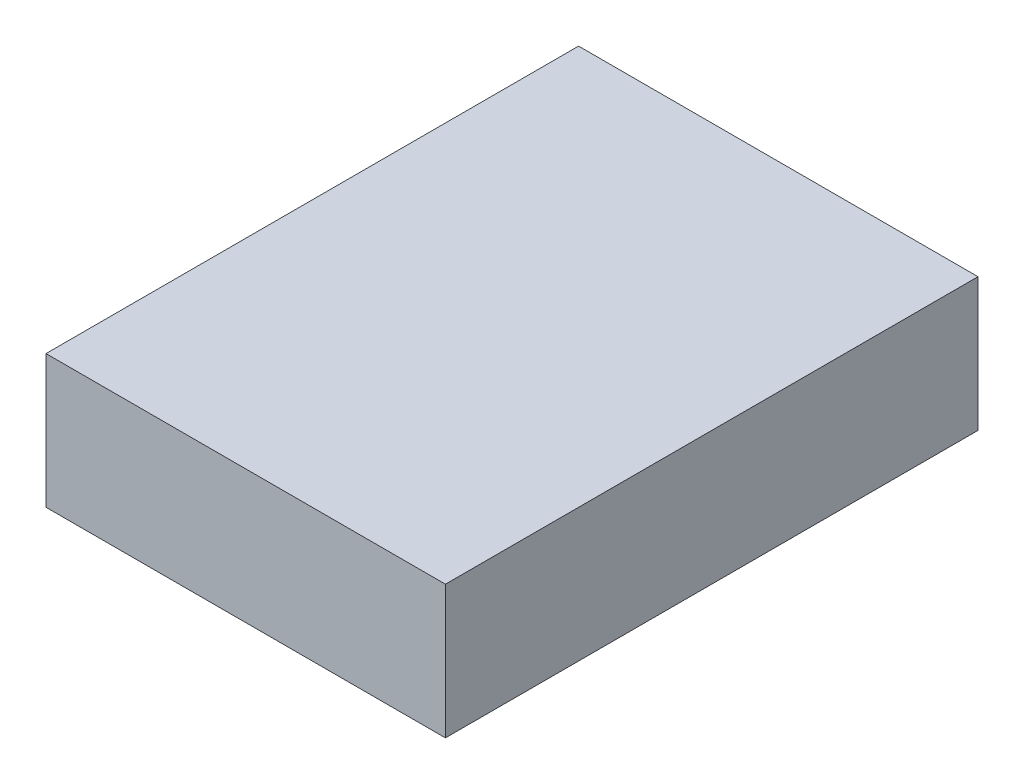
ISO-10303-21;
HEADER;
FILE_DESCRIPTION(('STEP AP214'),'2;1');
FILE_NAME('part.step','',(''),(''),'','','');
FILE_SCHEMA(('AUTOMOTIVE_DESIGN { 1 0 10303 214 1 1 1 1 }'));
ENDSEC;
DATA;
#1=APPLICATION_CONTEXT('core data for automotive mechanical design processes');
#2=APPLICATION_PROTOCOL_DEFINITION('international standard','automotive_design',2000,#1);
#3=PRODUCT_CONTEXT('',#1,'mechanical');
#4=PRODUCT('Part','Part','',(#3));
#5=PRODUCT_RELATED_PRODUCT_CATEGORY('part','',(#4));
#6=PRODUCT_DEFINITION_FORMATION('','',#4);
#7=PRODUCT_DEFINITION_CONTEXT('part definition',#1,'design');
#8=PRODUCT_DEFINITION('design','',#6,#7);
#9=PRODUCT_DEFINITION_SHAPE('','',#8);
#10=(LENGTH_UNIT() NAMED_UNIT(*) SI_UNIT(.MILLI.,.METRE.));
#11=(NAMED_UNIT(*) PLANE_ANGLE_UNIT() SI_UNIT($,.RADIAN.));
#12=(NAMED_UNIT(*) SI_UNIT($,.STERADIAN.) SOLID_ANGLE_UNIT());
#13=UNCERTAINTY_MEASURE_WITH_UNIT(LENGTH_MEASURE(1.E-05),#10,'distance_accuracy_value','');
#14=(GEOMETRIC_REPRESENTATION_CONTEXT(3) GLOBAL_UNCERTAINTY_ASSIGNED_CONTEXT((#13)) GLOBAL_UNIT_ASSIGNED_CONTEXT((#10,
#11,#12)) REPRESENTATION_CONTEXT('',''));
#15=CARTESIAN_POINT('',(0.,0.,0.));
#16=DIRECTION('',(0.,0.,1.));
#17=DIRECTION('',(1.,0.,0.));
#18=AXIS2_PLACEMENT_3D('',#15,#16,#17);
#19=CARTESIAN_POINT('',(-97.2314821254319,3.,-89.2737739004754));
#20=DIRECTION('',(-1.,0.,0.));
#21=DIRECTION('',(0.,0.,1.));
#22=AXIS2_PLACEMENT_3D('',#19,#20,#21);
#23=PLANE('',#22);
#24=DIRECTION('',(0.,0.,-1.));
#25=VECTOR('',#24,1.);
#26=CARTESIAN_POINT('',(-97.2314821254319,0.,-89.2737739004754));
#27=LINE('',#26,#25);
#28=CARTESIAN_POINT('',(-97.2314821254319,0.,-77.2737739004754));
#29=VERTEX_POINT('',#28);
#30=CARTESIAN_POINT('',(-97.2314821254319,0.,-89.2737739004754));
#31=VERTEX_POINT('',#30);
#32=EDGE_CURVE('E97',#29,#31,#27,.T.);
#33=ORIENTED_EDGE('',*,*,#32,.T.);
#34=DIRECTION('',(0.,-1.,0.));
#35=VECTOR('',#34,1.);
#36=CARTESIAN_POINT('',(-97.2314821254319,3.,-89.2737739004754));
#37=LINE('',#36,#35);
#38=CARTESIAN_POINT('',(-97.2314821254319,3.,-89.2737739004754));
#39=VERTEX_POINT('',#38);
#40=EDGE_CURVE('E11',#39,#31,#37,.T.);
#41=ORIENTED_EDGE('',*,*,#40,.F.);
#42=DIRECTION('',(0.,0.,-1.));
#43=VECTOR('',#42,1.);
#44=CARTESIAN_POINT('',(-97.2314821254319,3.,-89.2737739004754));
#45=LINE('',#44,#43);
#46=CARTESIAN_POINT('',(-97.2314821254319,3.,-77.2737739004754));
#47=VERTEX_POINT('',#46);
#48=EDGE_CURVE('E85',#47,#39,#45,.T.);
#49=ORIENTED_EDGE('',*,*,#48,.F.);
#50=DIRECTION('',(0.,-1.,0.));
#51=VECTOR('',#50,1.);
#52=CARTESIAN_POINT('',(-97.2314821254319,3.,-77.2737739004754));
#53=LINE('',#52,#51);
#54=EDGE_CURVE('E93',#47,#29,#53,.T.);
#55=ORIENTED_EDGE('',*,*,#54,.T.);
#56=EDGE_LOOP('',(#33,#41,#49,#55));
#57=FACE_BOUND('',#56,.T.);
#58=ADVANCED_FACE('F34',(#57),#23,.F.);
#59=CARTESIAN_POINT('',(-106.231482125432,3.,-89.2737739004754));
#60=DIRECTION('',(0.,0.,1.));
#61=DIRECTION('',(1.,0.,0.));
#62=AXIS2_PLACEMENT_3D('',#59,#60,#61);
#63=PLANE('',#62);
#64=DIRECTION('',(-1.,0.,0.));
#65=VECTOR('',#64,1.);
#66=CARTESIAN_POINT('',(-106.231482125432,0.,-89.2737739004754));
#67=LINE('',#66,#65);
#68=CARTESIAN_POINT('',(-106.231482125432,0.,-89.2737739004754));
#69=VERTEX_POINT('',#68);
#70=EDGE_CURVE('E89',#31,#69,#67,.T.);
#71=ORIENTED_EDGE('',*,*,#70,.T.);
#72=DIRECTION('',(0.,-1.,0.));
#73=VECTOR('',#72,1.);
#74=CARTESIAN_POINT('',(-106.231482125432,3.,-89.2737739004754));
#75=LINE('',#74,#73);
#76=CARTESIAN_POINT('',(-106.231482125432,3.,-89.2737739004754));
#77=VERTEX_POINT('',#76);
#78=EDGE_CURVE('E42',#77,#69,#75,.T.);
#79=ORIENTED_EDGE('',*,*,#78,.F.);
#80=DIRECTION('',(-1.,0.,0.));
#81=VECTOR('',#80,1.);
#82=CARTESIAN_POINT('',(-106.231482125432,3.,-89.2737739004754));
#83=LINE('',#82,#81);
#84=EDGE_CURVE('E80',#39,#77,#83,.T.);
#85=ORIENTED_EDGE('',*,*,#84,.F.);
#86=ORIENTED_EDGE('',*,*,#40,.T.);
#87=EDGE_LOOP('',(#71,#79,#85,#86));
#88=FACE_BOUND('',#87,.T.);
#89=ADVANCED_FACE('F88',(#88),#63,.F.);
#90=CARTESIAN_POINT('',(-106.231482125432,3.,-89.2737739004754));
#91=DIRECTION('',(1.,0.,0.));
#92=DIRECTION('',(0.,0.,-1.));
#93=AXIS2_PLACEMENT_3D('',#90,#91,#92);
#94=PLANE('',#93);
#95=DIRECTION('',(0.,0.,1.));
#96=VECTOR('',#95,1.);
#97=CARTESIAN_POINT('',(-106.231482125432,0.,-89.2737739004754));
#98=LINE('',#97,#96);
#99=CARTESIAN_POINT('',(-106.231482125432,0.,-77.2737739004754));
#100=VERTEX_POINT('',#99);
#101=EDGE_CURVE('E67',#69,#100,#98,.T.);
#102=ORIENTED_EDGE('',*,*,#101,.T.);
#103=DIRECTION('',(0.,-1.,0.));
#104=VECTOR('',#103,1.);
#105=CARTESIAN_POINT('',(-106.231482125432,3.,-77.2737739004754));
#106=LINE('',#105,#104);
#107=CARTESIAN_POINT('',(-106.231482125432,3.,-77.2737739004754));
#108=VERTEX_POINT('',#107);
#109=EDGE_CURVE('E90',#108,#100,#106,.T.);
#110=ORIENTED_EDGE('',*,*,#109,.F.);
#111=DIRECTION('',(0.,0.,1.));
#112=VECTOR('',#111,1.);
#113=CARTESIAN_POINT('',(-106.231482125432,3.,-89.2737739004754));
#114=LINE('',#113,#112);
#115=EDGE_CURVE('E83',#77,#108,#114,.T.);
#116=ORIENTED_EDGE('',*,*,#115,.F.);
#117=ORIENTED_EDGE('',*,*,#78,.T.);
#118=EDGE_LOOP('',(#102,#110,#116,#117));
#119=FACE_BOUND('',#118,.T.);
#120=ADVANCED_FACE('F91',(#119),#94,.F.);
#121=CARTESIAN_POINT('',(-106.231482125432,3.,-77.2737739004754));
#122=DIRECTION('',(0.,0.,-1.));
#123=DIRECTION('',(-1.,0.,0.));
#124=AXIS2_PLACEMENT_3D('',#121,#122,#123);
#125=PLANE('',#124);
#126=DIRECTION('',(1.,0.,0.));
#127=VECTOR('',#126,1.);
#128=CARTESIAN_POINT('',(-106.231482125432,0.,-77.2737739004754));
#129=LINE('',#128,#127);
#130=EDGE_CURVE('E73',#100,#29,#129,.T.);
#131=ORIENTED_EDGE('',*,*,#130,.T.);
#132=ORIENTED_EDGE('',*,*,#54,.F.);
#133=DIRECTION('',(1.,0.,0.));
#134=VECTOR('',#133,1.);
#135=CARTESIAN_POINT('',(-106.231482125432,3.,-77.2737739004754));
#136=LINE('',#135,#134);
#137=EDGE_CURVE('E50',#108,#47,#136,.T.);
#138=ORIENTED_EDGE('',*,*,#137,.F.);
#139=ORIENTED_EDGE('',*,*,#109,.T.);
#140=EDGE_LOOP('',(#131,#132,#138,#139));
#141=FACE_BOUND('',#140,.T.);
#142=ADVANCED_FACE('F104',(#141),#125,.F.);
#143=CARTESIAN_POINT('',(0.,3.,0.));
#144=DIRECTION('',(0.,1.,0.));
#145=DIRECTION('',(0.,0.,1.));
#146=AXIS2_PLACEMENT_3D('',#143,#144,#145);
#147=PLANE('',#146);
#148=ORIENTED_EDGE('',*,*,#48,.T.);
#149=ORIENTED_EDGE('',*,*,#84,.T.);
#150=ORIENTED_EDGE('',*,*,#115,.T.);
#151=ORIENTED_EDGE('',*,*,#137,.T.);
#152=EDGE_LOOP('',(#148,#149,#150,#151));
#153=FACE_BOUND('',#152,.T.);
#154=ADVANCED_FACE('F81',(#153),#147,.T.);
#155=CARTESIAN_POINT('',(0.,0.,0.));
#156=DIRECTION('',(0.,1.,0.));
#157=DIRECTION('',(0.,0.,1.));
#158=AXIS2_PLACEMENT_3D('',#155,#156,#157);
#159=PLANE('',#158);
#160=ORIENTED_EDGE('',*,*,#32,.F.);
#161=ORIENTED_EDGE('',*,*,#130,.F.);
#162=ORIENTED_EDGE('',*,*,#101,.F.);
#163=ORIENTED_EDGE('',*,*,#70,.F.);
#164=EDGE_LOOP('',(#160,#161,#162,#163));
#165=FACE_BOUND('',#164,.T.);
#166=ADVANCED_FACE('F107',(#165),#159,.F.);
#167=CLOSED_SHELL('',(#58,#89,#120,#142,#154,#166));
#168=MANIFOLD_SOLID_BREP('B2',#167);
#169=ADVANCED_BREP_SHAPE_REPRESENTATION('',(#18,#168),#14);
#170=SHAPE_DEFINITION_REPRESENTATION(#9,#169);
ENDSEC;
END-ISO-10303-21;
